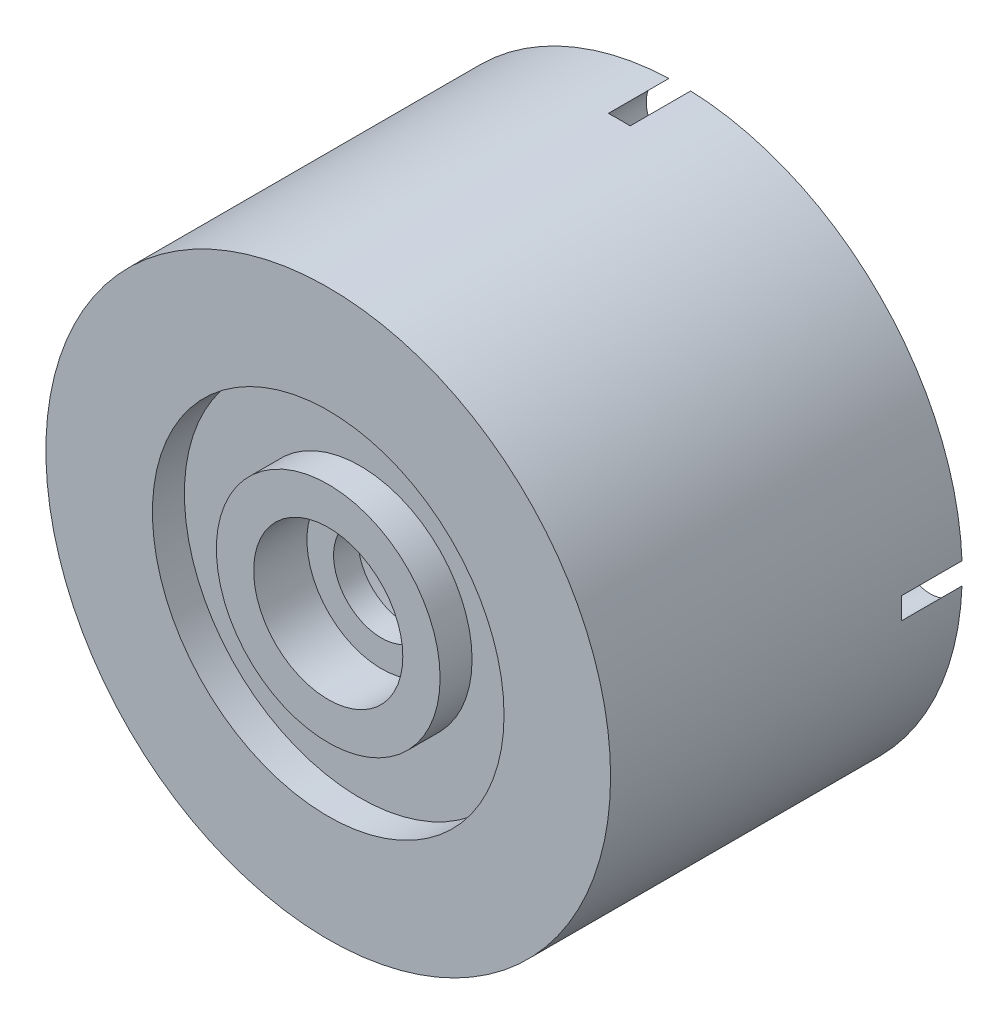
ISO-10303-21;
HEADER;
FILE_DESCRIPTION(('STEP AP214'),'2;1');
FILE_NAME('part.step','',(''),(''),'','','');
FILE_SCHEMA(('AUTOMOTIVE_DESIGN { 1 0 10303 214 1 1 1 1 }'));
ENDSEC;
DATA;
#1=APPLICATION_CONTEXT('core data for automotive mechanical design processes');
#2=APPLICATION_PROTOCOL_DEFINITION('international standard','automotive_design',2000,#1);
#3=PRODUCT_CONTEXT('',#1,'mechanical');
#4=PRODUCT('Part','Part','',(#3));
#5=PRODUCT_RELATED_PRODUCT_CATEGORY('part','',(#4));
#6=PRODUCT_DEFINITION_FORMATION('','',#4);
#7=PRODUCT_DEFINITION_CONTEXT('part definition',#1,'design');
#8=PRODUCT_DEFINITION('design','',#6,#7);
#9=PRODUCT_DEFINITION_SHAPE('','',#8);
#10=(LENGTH_UNIT() NAMED_UNIT(*) SI_UNIT(.MILLI.,.METRE.));
#11=(NAMED_UNIT(*) PLANE_ANGLE_UNIT() SI_UNIT($,.RADIAN.));
#12=(NAMED_UNIT(*) SI_UNIT($,.STERADIAN.) SOLID_ANGLE_UNIT());
#13=UNCERTAINTY_MEASURE_WITH_UNIT(LENGTH_MEASURE(1.E-05),#10,'distance_accuracy_value','');
#14=(GEOMETRIC_REPRESENTATION_CONTEXT(3) GLOBAL_UNCERTAINTY_ASSIGNED_CONTEXT((#13)) GLOBAL_UNIT_ASSIGNED_CONTEXT((#10,
#11,#12)) REPRESENTATION_CONTEXT('',''));
#15=CARTESIAN_POINT('',(0.,0.,0.));
#16=DIRECTION('',(0.,0.,1.));
#17=DIRECTION('',(1.,0.,0.));
#18=AXIS2_PLACEMENT_3D('',#15,#16,#17);
#19=CARTESIAN_POINT('',(0.,0.,-11.01));
#20=DIRECTION('',(0.,0.,-1.));
#21=DIRECTION('',(-1.,0.,0.));
#22=AXIS2_PLACEMENT_3D('',#19,#20,#21);
#23=CYLINDRICAL_SURFACE('',#22,21.5);
#24=CARTESIAN_POINT('',(0.,0.,-11.01));
#25=DIRECTION('',(0.,0.,1.));
#26=DIRECTION('',(1.,0.,0.));
#27=AXIS2_PLACEMENT_3D('',#24,#25,#26);
#28=CIRCLE('',#27,21.5);
#29=CARTESIAN_POINT('',(21.5,0.,-11.01));
#30=VERTEX_POINT('',#29);
#31=EDGE_CURVE('E342',#30,#30,#28,.T.);
#32=ORIENTED_EDGE('',*,*,#31,.T.);
#33=EDGE_LOOP('',(#32));
#34=FACE_BOUND('',#33,.T.);
#35=CARTESIAN_POINT('',(0.,0.,-31.01));
#36=DIRECTION('',(0.,0.,1.));
#37=DIRECTION('',(1.,0.,0.));
#38=AXIS2_PLACEMENT_3D('',#35,#36,#37);
#39=CIRCLE('',#38,21.5);
#40=CARTESIAN_POINT('',(-2.3243448035617,-21.3739893617021,-31.01));
#41=VERTEX_POINT('',#40);
#42=CARTESIAN_POINT('',(2.3243448035617,-21.3739893617021,-31.01));
#43=VERTEX_POINT('',#42);
#44=EDGE_CURVE('E205',#41,#43,#39,.T.);
#45=ORIENTED_EDGE('',*,*,#44,.F.);
#46=DIRECTION('',(0.,0.,-1.));
#47=VECTOR('',#46,1.);
#48=CARTESIAN_POINT('',(-2.3243448035617,-21.3739893617021,-33.86));
#49=LINE('',#48,#47);
#50=CARTESIAN_POINT('',(-2.3243448035617,-21.3739893617021,-36.7));
#51=VERTEX_POINT('',#50);
#52=EDGE_CURVE('E213',#41,#51,#49,.T.);
#53=ORIENTED_EDGE('',*,*,#52,.T.);
#54=CARTESIAN_POINT('',(0.,0.,-36.7));
#55=DIRECTION('',(0.,0.,1.));
#56=DIRECTION('',(1.,0.,0.));
#57=AXIS2_PLACEMENT_3D('',#54,#55,#56);
#58=CIRCLE('',#57,21.5);
#59=CARTESIAN_POINT('',(-13.4875511302153,-16.7432363809936,-36.7));
#60=VERTEX_POINT('',#59);
#61=EDGE_CURVE('E359',#51,#60,#58,.F.);
#62=ORIENTED_EDGE('',*,*,#61,.T.);
#63=DIRECTION('',(0.,0.,-1.));
#64=VECTOR('',#63,1.);
#65=CARTESIAN_POINT('',(-13.4875511302153,-16.7432363809936,-31.2));
#66=LINE('',#65,#64);
#67=CARTESIAN_POINT('',(-13.4875511302153,-16.7432363809936,-25.7));
#68=VERTEX_POINT('',#67);
#69=EDGE_CURVE('E295',#60,#68,#66,.F.);
#70=ORIENTED_EDGE('',*,*,#69,.T.);
#71=CARTESIAN_POINT('',(0.,0.,-25.7));
#72=DIRECTION('',(0.,0.,1.));
#73=DIRECTION('',(1.,0.,0.));
#74=AXIS2_PLACEMENT_3D('',#71,#72,#73);
#75=CIRCLE('',#74,21.5);
#76=CARTESIAN_POINT('',(-16.7432363809936,-13.4875511302153,-25.7));
#77=VERTEX_POINT('',#76);
#78=EDGE_CURVE('E380',#77,#68,#75,.T.);
#79=ORIENTED_EDGE('',*,*,#78,.F.);
#80=DIRECTION('',(0.,0.,-1.));
#81=VECTOR('',#80,1.);
#82=CARTESIAN_POINT('',(-16.7432363809936,-13.4875511302153,-31.2));
#83=LINE('',#82,#81);
#84=CARTESIAN_POINT('',(-16.7432363809936,-13.4875511302153,-36.7));
#85=VERTEX_POINT('',#84);
#86=EDGE_CURVE('E300',#77,#85,#83,.T.);
#87=ORIENTED_EDGE('',*,*,#86,.T.);
#88=CARTESIAN_POINT('',(-21.3739893617021,-2.3243448035617,-36.7));
#89=VERTEX_POINT('',#88);
#90=EDGE_CURVE('E423',#85,#89,#58,.F.);
#91=ORIENTED_EDGE('',*,*,#90,.T.);
#92=DIRECTION('',(0.,0.,-1.));
#93=VECTOR('',#92,1.);
#94=CARTESIAN_POINT('',(-21.3739893617021,-2.3243448035617,-33.86));
#95=LINE('',#94,#93);
#96=CARTESIAN_POINT('',(-21.3739893617021,-2.3243448035617,-31.01));
#97=VERTEX_POINT('',#96);
#98=EDGE_CURVE('E236',#89,#97,#95,.F.);
#99=ORIENTED_EDGE('',*,*,#98,.T.);
#100=CARTESIAN_POINT('',(0.,0.,-31.01));
#101=DIRECTION('',(0.,0.,1.));
#102=DIRECTION('',(1.,0.,0.));
#103=AXIS2_PLACEMENT_3D('',#100,#101,#102);
#104=CIRCLE('',#103,21.5);
#105=CARTESIAN_POINT('',(-21.3739893617021,2.3243448035617,-31.01));
#106=VERTEX_POINT('',#105);
#107=EDGE_CURVE('E239',#106,#97,#104,.T.);
#108=ORIENTED_EDGE('',*,*,#107,.F.);
#109=DIRECTION('',(0.,0.,-1.));
#110=VECTOR('',#109,1.);
#111=CARTESIAN_POINT('',(-21.3739893617021,2.3243448035617,-33.86));
#112=LINE('',#111,#110);
#113=CARTESIAN_POINT('',(-21.3739893617021,2.3243448035617,-36.7));
#114=VERTEX_POINT('',#113);
#115=EDGE_CURVE('E231',#106,#114,#112,.T.);
#116=ORIENTED_EDGE('',*,*,#115,.T.);
#117=CARTESIAN_POINT('',(-16.7432363809936,13.4875511302153,-36.7));
#118=VERTEX_POINT('',#117);
#119=EDGE_CURVE('E424',#114,#118,#58,.F.);
#120=ORIENTED_EDGE('',*,*,#119,.T.);
#121=DIRECTION('',(0.,0.,-1.));
#122=VECTOR('',#121,1.);
#123=CARTESIAN_POINT('',(-16.7432363809936,13.4875511302153,-31.2));
#124=LINE('',#123,#122);
#125=CARTESIAN_POINT('',(-16.7432363809936,13.4875511302153,-25.7));
#126=VERTEX_POINT('',#125);
#127=EDGE_CURVE('E309',#118,#126,#124,.F.);
#128=ORIENTED_EDGE('',*,*,#127,.T.);
#129=CARTESIAN_POINT('',(0.,0.,-25.7));
#130=DIRECTION('',(0.,0.,1.));
#131=DIRECTION('',(1.,0.,0.));
#132=AXIS2_PLACEMENT_3D('',#129,#130,#131);
#133=CIRCLE('',#132,21.5);
#134=CARTESIAN_POINT('',(-13.4875511302153,16.7432363809936,-25.7));
#135=VERTEX_POINT('',#134);
#136=EDGE_CURVE('E375',#135,#126,#133,.T.);
#137=ORIENTED_EDGE('',*,*,#136,.F.);
#138=DIRECTION('',(0.,0.,-1.));
#139=VECTOR('',#138,1.);
#140=CARTESIAN_POINT('',(-13.4875511302153,16.7432363809936,-31.2));
#141=LINE('',#140,#139);
#142=CARTESIAN_POINT('',(-13.4875511302153,16.7432363809936,-36.7));
#143=VERTEX_POINT('',#142);
#144=EDGE_CURVE('E314',#135,#143,#141,.T.);
#145=ORIENTED_EDGE('',*,*,#144,.T.);
#146=CARTESIAN_POINT('',(-2.3243448035617,21.3739893617021,-36.7));
#147=VERTEX_POINT('',#146);
#148=EDGE_CURVE('E360',#143,#147,#58,.F.);
#149=ORIENTED_EDGE('',*,*,#148,.T.);
#150=DIRECTION('',(0.,0.,-1.));
#151=VECTOR('',#150,1.);
#152=CARTESIAN_POINT('',(-2.3243448035617,21.3739893617021,-33.86));
#153=LINE('',#152,#151);
#154=CARTESIAN_POINT('',(-2.3243448035617,21.3739893617021,-31.01));
#155=VERTEX_POINT('',#154);
#156=EDGE_CURVE('E252',#147,#155,#153,.F.);
#157=ORIENTED_EDGE('',*,*,#156,.T.);
#158=CARTESIAN_POINT('',(0.,0.,-31.01));
#159=DIRECTION('',(0.,0.,1.));
#160=DIRECTION('',(1.,0.,0.));
#161=AXIS2_PLACEMENT_3D('',#158,#159,#160);
#162=CIRCLE('',#161,21.5);
#163=CARTESIAN_POINT('',(2.3243448035617,21.3739893617021,-31.01));
#164=VERTEX_POINT('',#163);
#165=EDGE_CURVE('E255',#164,#155,#162,.T.);
#166=ORIENTED_EDGE('',*,*,#165,.F.);
#167=DIRECTION('',(0.,0.,-1.));
#168=VECTOR('',#167,1.);
#169=CARTESIAN_POINT('',(2.3243448035617,21.3739893617021,-33.86));
#170=LINE('',#169,#168);
#171=CARTESIAN_POINT('',(2.3243448035617,21.3739893617021,-36.7));
#172=VERTEX_POINT('',#171);
#173=EDGE_CURVE('E247',#164,#172,#170,.T.);
#174=ORIENTED_EDGE('',*,*,#173,.T.);
#175=CARTESIAN_POINT('',(13.4875511302156,16.7432363809934,-36.7));
#176=VERTEX_POINT('',#175);
#177=EDGE_CURVE('E345',#172,#176,#58,.F.);
#178=ORIENTED_EDGE('',*,*,#177,.T.);
#179=DIRECTION('',(0.,0.,-1.));
#180=VECTOR('',#179,1.);
#181=CARTESIAN_POINT('',(13.4875511302156,16.7432363809934,-31.2));
#182=LINE('',#181,#180);
#183=CARTESIAN_POINT('',(13.4875511302156,16.7432363809934,-25.7));
#184=VERTEX_POINT('',#183);
#185=EDGE_CURVE('E371',#176,#184,#182,.F.);
#186=ORIENTED_EDGE('',*,*,#185,.T.);
#187=CARTESIAN_POINT('',(0.,0.,-25.7));
#188=DIRECTION('',(0.,0.,1.));
#189=DIRECTION('',(1.,0.,0.));
#190=AXIS2_PLACEMENT_3D('',#187,#188,#189);
#191=CIRCLE('',#190,21.5);
#192=CARTESIAN_POINT('',(16.7432363809934,13.4875511302156,-25.7));
#193=VERTEX_POINT('',#192);
#194=EDGE_CURVE('E349',#193,#184,#191,.T.);
#195=ORIENTED_EDGE('',*,*,#194,.F.);
#196=DIRECTION('',(0.,0.,-1.));
#197=VECTOR('',#196,1.);
#198=CARTESIAN_POINT('',(16.7432363809934,13.4875511302156,-31.2));
#199=LINE('',#198,#197);
#200=CARTESIAN_POINT('',(16.7432363809934,13.4875511302156,-36.7));
#201=VERTEX_POINT('',#200);
#202=EDGE_CURVE('E373',#193,#201,#199,.T.);
#203=ORIENTED_EDGE('',*,*,#202,.T.);
#204=CARTESIAN_POINT('',(21.3739893617021,2.3243448035617,-36.7));
#205=VERTEX_POINT('',#204);
#206=EDGE_CURVE('E355',#201,#205,#58,.F.);
#207=ORIENTED_EDGE('',*,*,#206,.T.);
#208=DIRECTION('',(0.,0.,-1.));
#209=VECTOR('',#208,1.);
#210=CARTESIAN_POINT('',(21.3739893617021,2.3243448035617,-33.86));
#211=LINE('',#210,#209);
#212=CARTESIAN_POINT('',(21.3739893617021,2.3243448035617,-31.01));
#213=VERTEX_POINT('',#212);
#214=EDGE_CURVE('E263',#205,#213,#211,.F.);
#215=ORIENTED_EDGE('',*,*,#214,.T.);
#216=CARTESIAN_POINT('',(0.,0.,-31.01));
#217=DIRECTION('',(0.,0.,1.));
#218=DIRECTION('',(1.,0.,0.));
#219=AXIS2_PLACEMENT_3D('',#216,#217,#218);
#220=CIRCLE('',#219,21.5);
#221=CARTESIAN_POINT('',(21.3739893617021,-2.3243448035617,-31.01));
#222=VERTEX_POINT('',#221);
#223=EDGE_CURVE('E272',#222,#213,#220,.T.);
#224=ORIENTED_EDGE('',*,*,#223,.F.);
#225=DIRECTION('',(0.,0.,-1.));
#226=VECTOR('',#225,1.);
#227=CARTESIAN_POINT('',(21.3739893617021,-2.3243448035617,-33.86));
#228=LINE('',#227,#226);
#229=CARTESIAN_POINT('',(21.3739893617021,-2.3243448035617,-36.7));
#230=VERTEX_POINT('',#229);
#231=EDGE_CURVE('E269',#222,#230,#228,.T.);
#232=ORIENTED_EDGE('',*,*,#231,.T.);
#233=CARTESIAN_POINT('',(16.7432363809936,-13.4875511302153,-36.7));
#234=VERTEX_POINT('',#233);
#235=EDGE_CURVE('E358',#230,#234,#58,.F.);
#236=ORIENTED_EDGE('',*,*,#235,.T.);
#237=DIRECTION('',(0.,0.,-1.));
#238=VECTOR('',#237,1.);
#239=CARTESIAN_POINT('',(16.7432363809936,-13.4875511302153,-31.2));
#240=LINE('',#239,#238);
#241=CARTESIAN_POINT('',(16.7432363809936,-13.4875511302153,-25.7));
#242=VERTEX_POINT('',#241);
#243=EDGE_CURVE('E281',#234,#242,#240,.F.);
#244=ORIENTED_EDGE('',*,*,#243,.T.);
#245=CARTESIAN_POINT('',(0.,0.,-25.7));
#246=DIRECTION('',(0.,0.,1.));
#247=DIRECTION('',(1.,0.,0.));
#248=AXIS2_PLACEMENT_3D('',#245,#246,#247);
#249=CIRCLE('',#248,21.5);
#250=CARTESIAN_POINT('',(13.4875511302153,-16.7432363809936,-25.7));
#251=VERTEX_POINT('',#250);
#252=EDGE_CURVE('E385',#251,#242,#249,.T.);
#253=ORIENTED_EDGE('',*,*,#252,.F.);
#254=DIRECTION('',(0.,0.,-1.));
#255=VECTOR('',#254,1.);
#256=CARTESIAN_POINT('',(13.4875511302153,-16.7432363809936,-31.2));
#257=LINE('',#256,#255);
#258=CARTESIAN_POINT('',(13.4875511302153,-16.7432363809936,-36.7));
#259=VERTEX_POINT('',#258);
#260=EDGE_CURVE('E286',#251,#259,#257,.T.);
#261=ORIENTED_EDGE('',*,*,#260,.T.);
#262=CARTESIAN_POINT('',(2.3243448035617,-21.3739893617021,-36.7));
#263=VERTEX_POINT('',#262);
#264=EDGE_CURVE('E221',#259,#263,#58,.F.);
#265=ORIENTED_EDGE('',*,*,#264,.T.);
#266=DIRECTION('',(0.,0.,-1.));
#267=VECTOR('',#266,1.);
#268=CARTESIAN_POINT('',(2.3243448035617,-21.3739893617021,-33.86));
#269=LINE('',#268,#267);
#270=EDGE_CURVE('E56',#263,#43,#269,.F.);
#271=ORIENTED_EDGE('',*,*,#270,.T.);
#272=EDGE_LOOP('',(#45,#53,#62,#70,#79,#87,#91,#99,#108,#116,#120,#128,#137,#145,#149,#157,#166,
#174,#178,#186,#195,#203,#207,#215,#224,#232,#236,#244,#253,#261,#265,#271));
#273=FACE_BOUND('',#272,.T.);
#274=ADVANCED_FACE('F41',(#34,#273),#23,.F.);
#275=CARTESIAN_POINT('',(0.,0.,-3.7));
#276=DIRECTION('',(0.,0.,-1.));
#277=DIRECTION('',(-1.,0.,0.));
#278=AXIS2_PLACEMENT_3D('',#275,#276,#277);
#279=CYLINDRICAL_SURFACE('',#278,26.5);
#280=CARTESIAN_POINT('',(0.,0.,-3.7));
#281=DIRECTION('',(0.,0.,1.));
#282=DIRECTION('',(1.,0.,0.));
#283=AXIS2_PLACEMENT_3D('',#280,#281,#282);
#284=CIRCLE('',#283,26.5);
#285=CARTESIAN_POINT('',(26.5,0.,-3.7));
#286=VERTEX_POINT('',#285);
#287=EDGE_CURVE('E346',#286,#286,#284,.T.);
#288=ORIENTED_EDGE('',*,*,#287,.F.);
#289=EDGE_LOOP('',(#288));
#290=FACE_BOUND('',#289,.T.);
#291=DIRECTION('',(0.,0.,-1.));
#292=VECTOR('',#291,1.);
#293=CARTESIAN_POINT('',(-1.01974541549667,-26.4803723404255,-33.86));
#294=LINE('',#293,#292);
#295=CARTESIAN_POINT('',(-1.01974541549666,-26.4803723404255,-31.01));
#296=VERTEX_POINT('',#295);
#297=CARTESIAN_POINT('',(-1.01974541549667,-26.4803723404255,-36.7));
#298=VERTEX_POINT('',#297);
#299=EDGE_CURVE('E222',#296,#298,#294,.T.);
#300=ORIENTED_EDGE('',*,*,#299,.F.);
#301=CARTESIAN_POINT('',(0.,0.,-31.01));
#302=DIRECTION('',(0.,0.,1.));
#303=DIRECTION('',(1.,0.,0.));
#304=AXIS2_PLACEMENT_3D('',#301,#302,#303);
#305=CIRCLE('',#304,26.5);
#306=CARTESIAN_POINT('',(1.01974541549666,-26.4803723404255,-31.01));
#307=VERTEX_POINT('',#306);
#308=EDGE_CURVE('E11',#296,#307,#305,.T.);
#309=ORIENTED_EDGE('',*,*,#308,.T.);
#310=DIRECTION('',(0.,0.,-1.));
#311=VECTOR('',#310,1.);
#312=CARTESIAN_POINT('',(1.01974541549667,-26.4803723404255,-33.86));
#313=LINE('',#312,#311);
#314=CARTESIAN_POINT('',(1.01974541549667,-26.4803723404255,-36.7));
#315=VERTEX_POINT('',#314);
#316=EDGE_CURVE('E217',#315,#307,#313,.F.);
#317=ORIENTED_EDGE('',*,*,#316,.F.);
#318=CARTESIAN_POINT('',(0.,0.,-36.7));
#319=DIRECTION('',(0.,0.,1.));
#320=DIRECTION('',(1.,0.,0.));
#321=AXIS2_PLACEMENT_3D('',#318,#319,#320);
#322=CIRCLE('',#321,26.5);
#323=CARTESIAN_POINT('',(26.4803723404255,-1.01974541549667,-36.7));
#324=VERTEX_POINT('',#323);
#325=EDGE_CURVE('E354',#315,#324,#322,.T.);
#326=ORIENTED_EDGE('',*,*,#325,.T.);
#327=DIRECTION('',(0.,0.,-1.));
#328=VECTOR('',#327,1.);
#329=CARTESIAN_POINT('',(26.4803723404255,-1.01974541549667,-33.86));
#330=LINE('',#329,#328);
#331=CARTESIAN_POINT('',(26.4803723404255,-1.01974541549665,-31.01));
#332=VERTEX_POINT('',#331);
#333=EDGE_CURVE('E266',#332,#324,#330,.T.);
#334=ORIENTED_EDGE('',*,*,#333,.F.);
#335=CARTESIAN_POINT('',(0.,0.,-31.01));
#336=DIRECTION('',(0.,0.,1.));
#337=DIRECTION('',(1.,0.,0.));
#338=AXIS2_PLACEMENT_3D('',#335,#336,#337);
#339=CIRCLE('',#338,26.5);
#340=CARTESIAN_POINT('',(26.4803723404255,1.01974541549666,-31.01));
#341=VERTEX_POINT('',#340);
#342=EDGE_CURVE('E395',#332,#341,#339,.T.);
#343=ORIENTED_EDGE('',*,*,#342,.T.);
#344=DIRECTION('',(0.,0.,-1.));
#345=VECTOR('',#344,1.);
#346=CARTESIAN_POINT('',(26.4803723404255,1.01974541549667,-33.86));
#347=LINE('',#346,#345);
#348=CARTESIAN_POINT('',(26.4803723404255,1.01974541549667,-36.7));
#349=VERTEX_POINT('',#348);
#350=EDGE_CURVE('E261',#349,#341,#347,.F.);
#351=ORIENTED_EDGE('',*,*,#350,.F.);
#352=CARTESIAN_POINT('',(1.01974541549667,26.4803723404255,-36.7));
#353=VERTEX_POINT('',#352);
#354=EDGE_CURVE('E350',#349,#353,#322,.T.);
#355=ORIENTED_EDGE('',*,*,#354,.T.);
#356=DIRECTION('',(0.,0.,-1.));
#357=VECTOR('',#356,1.);
#358=CARTESIAN_POINT('',(1.01974541549667,26.4803723404255,-33.86));
#359=LINE('',#358,#357);
#360=CARTESIAN_POINT('',(1.01974541549666,26.4803723404255,-31.01));
#361=VERTEX_POINT('',#360);
#362=EDGE_CURVE('E245',#361,#353,#359,.T.);
#363=ORIENTED_EDGE('',*,*,#362,.F.);
#364=CARTESIAN_POINT('',(0.,0.,-31.01));
#365=DIRECTION('',(0.,0.,1.));
#366=DIRECTION('',(1.,0.,0.));
#367=AXIS2_PLACEMENT_3D('',#364,#365,#366);
#368=CIRCLE('',#367,26.5);
#369=CARTESIAN_POINT('',(-1.01974541549666,26.4803723404255,-31.01));
#370=VERTEX_POINT('',#369);
#371=EDGE_CURVE('E401',#361,#370,#368,.T.);
#372=ORIENTED_EDGE('',*,*,#371,.T.);
#373=DIRECTION('',(0.,0.,-1.));
#374=VECTOR('',#373,1.);
#375=CARTESIAN_POINT('',(-1.01974541549667,26.4803723404255,-33.86));
#376=LINE('',#375,#374);
#377=CARTESIAN_POINT('',(-1.01974541549667,26.4803723404255,-36.7));
#378=VERTEX_POINT('',#377);
#379=EDGE_CURVE('E250',#378,#370,#376,.F.);
#380=ORIENTED_EDGE('',*,*,#379,.F.);
#381=CARTESIAN_POINT('',(-26.4803723404255,1.01974541549667,-36.7));
#382=VERTEX_POINT('',#381);
#383=EDGE_CURVE('E353',#378,#382,#322,.T.);
#384=ORIENTED_EDGE('',*,*,#383,.T.);
#385=DIRECTION('',(0.,0.,-1.));
#386=VECTOR('',#385,1.);
#387=CARTESIAN_POINT('',(-26.4803723404255,1.01974541549666,-33.86));
#388=LINE('',#387,#386);
#389=CARTESIAN_POINT('',(-26.4803723404255,1.01974541549665,-31.01));
#390=VERTEX_POINT('',#389);
#391=EDGE_CURVE('E64',#390,#382,#388,.T.);
#392=ORIENTED_EDGE('',*,*,#391,.F.);
#393=CARTESIAN_POINT('',(0.,0.,-31.01));
#394=DIRECTION('',(0.,0.,1.));
#395=DIRECTION('',(1.,0.,0.));
#396=AXIS2_PLACEMENT_3D('',#393,#394,#395);
#397=CIRCLE('',#396,26.5);
#398=CARTESIAN_POINT('',(-26.4803723404255,-1.01974541549666,-31.01));
#399=VERTEX_POINT('',#398);
#400=EDGE_CURVE('E407',#390,#399,#397,.T.);
#401=ORIENTED_EDGE('',*,*,#400,.T.);
#402=DIRECTION('',(0.,0.,-1.));
#403=VECTOR('',#402,1.);
#404=CARTESIAN_POINT('',(-26.4803723404255,-1.01974541549667,-33.86));
#405=LINE('',#404,#403);
#406=CARTESIAN_POINT('',(-26.4803723404255,-1.01974541549668,-36.7));
#407=VERTEX_POINT('',#406);
#408=EDGE_CURVE('E234',#407,#399,#405,.F.);
#409=ORIENTED_EDGE('',*,*,#408,.F.);
#410=EDGE_CURVE('E446',#407,#298,#322,.T.);
#411=ORIENTED_EDGE('',*,*,#410,.T.);
#412=EDGE_LOOP('',(#300,#309,#317,#326,#334,#343,#351,#355,#363,#372,#380,#384,#392,#401,#409,#411));
#413=FACE_BOUND('',#412,.T.);
#414=ADVANCED_FACE('F43',(#290,#413),#279,.T.);
#415=CARTESIAN_POINT('',(0.,0.,-36.7));
#416=DIRECTION('',(0.,0.,1.));
#417=DIRECTION('',(1.,0.,0.));
#418=AXIS2_PLACEMENT_3D('',#415,#416,#417);
#419=PLANE('',#418);
#420=CARTESIAN_POINT('',(0.,-23.5,-36.7));
#421=DIRECTION('',(0.,0.,1.));
#422=DIRECTION('',(1.,0.,0.));
#423=AXIS2_PLACEMENT_3D('',#420,#421,#422);
#424=CIRCLE('',#423,3.15);
#425=EDGE_CURVE('E49',#298,#51,#424,.F.);
#426=ORIENTED_EDGE('',*,*,#425,.F.);
#427=ORIENTED_EDGE('',*,*,#410,.F.);
#428=CARTESIAN_POINT('',(-23.5,0.,-36.7));
#429=DIRECTION('',(0.,0.,1.));
#430=DIRECTION('',(1.,0.,0.));
#431=AXIS2_PLACEMENT_3D('',#428,#429,#430);
#432=CIRCLE('',#431,3.15);
#433=EDGE_CURVE('E406',#89,#407,#432,.F.);
#434=ORIENTED_EDGE('',*,*,#433,.F.);
#435=ORIENTED_EDGE('',*,*,#90,.F.);
#436=CARTESIAN_POINT('',(-16.4755880016466,-16.4755880016466,-36.7));
#437=DIRECTION('',(0.,0.,1.));
#438=DIRECTION('',(1.,0.,0.));
#439=AXIS2_PLACEMENT_3D('',#436,#437,#438);
#440=CIRCLE('',#439,3.);
#441=EDGE_CURVE('E296',#60,#85,#440,.T.);
#442=ORIENTED_EDGE('',*,*,#441,.F.);
#443=ORIENTED_EDGE('',*,*,#61,.F.);
#444=EDGE_LOOP('',(#426,#427,#434,#435,#442,#443));
#445=FACE_BOUND('',#444,.T.);
#446=CARTESIAN_POINT('',(-16.4755880016466,-16.4755880016466,-36.7));
#447=DIRECTION('',(0.,0.,1.));
#448=DIRECTION('',(1.,0.,0.));
#449=AXIS2_PLACEMENT_3D('',#446,#447,#448);
#450=CIRCLE('',#449,1.4);
#451=CARTESIAN_POINT('',(-15.0755880016466,-16.4755880016466,-36.7));
#452=VERTEX_POINT('',#451);
#453=EDGE_CURVE('E291',#452,#452,#450,.F.);
#454=ORIENTED_EDGE('',*,*,#453,.F.);
#455=EDGE_LOOP('',(#454));
#456=FACE_BOUND('',#455,.T.);
#457=ADVANCED_FACE('F420',(#445,#456),#419,.F.);
#458=EDGE_CURVE('E409',#263,#315,#424,.F.);
#459=ORIENTED_EDGE('',*,*,#458,.F.);
#460=ORIENTED_EDGE('',*,*,#264,.F.);
#461=CARTESIAN_POINT('',(16.4755880016466,-16.4755880016466,-36.7));
#462=DIRECTION('',(0.,0.,1.));
#463=DIRECTION('',(1.,0.,0.));
#464=AXIS2_PLACEMENT_3D('',#461,#462,#463);
#465=CIRCLE('',#464,3.);
#466=EDGE_CURVE('E282',#234,#259,#465,.T.);
#467=ORIENTED_EDGE('',*,*,#466,.F.);
#468=ORIENTED_EDGE('',*,*,#235,.F.);
#469=CARTESIAN_POINT('',(23.5,0.,-36.7));
#470=DIRECTION('',(0.,0.,1.));
#471=DIRECTION('',(1.,0.,0.));
#472=AXIS2_PLACEMENT_3D('',#469,#470,#471);
#473=CIRCLE('',#472,3.15);
#474=EDGE_CURVE('E394',#324,#230,#473,.F.);
#475=ORIENTED_EDGE('',*,*,#474,.F.);
#476=ORIENTED_EDGE('',*,*,#325,.F.);
#477=EDGE_LOOP('',(#459,#460,#467,#468,#475,#476));
#478=FACE_BOUND('',#477,.T.);
#479=CARTESIAN_POINT('',(16.4755880016466,-16.4755880016466,-36.7));
#480=DIRECTION('',(0.,0.,1.));
#481=DIRECTION('',(1.,0.,0.));
#482=AXIS2_PLACEMENT_3D('',#479,#480,#481);
#483=CIRCLE('',#482,1.4);
#484=CARTESIAN_POINT('',(17.8755880016466,-16.4755880016466,-36.7));
#485=VERTEX_POINT('',#484);
#486=EDGE_CURVE('E277',#485,#485,#483,.F.);
#487=ORIENTED_EDGE('',*,*,#486,.F.);
#488=EDGE_LOOP('',(#487));
#489=FACE_BOUND('',#488,.T.);
#490=ADVANCED_FACE('F441',(#478,#489),#419,.F.);
#491=EDGE_CURVE('E404',#382,#114,#432,.F.);
#492=ORIENTED_EDGE('',*,*,#491,.F.);
#493=ORIENTED_EDGE('',*,*,#383,.F.);
#494=CARTESIAN_POINT('',(0.,23.5,-36.7));
#495=DIRECTION('',(0.,0.,1.));
#496=DIRECTION('',(1.,0.,0.));
#497=AXIS2_PLACEMENT_3D('',#494,#495,#496);
#498=CIRCLE('',#497,3.15);
#499=EDGE_CURVE('E400',#147,#378,#498,.F.);
#500=ORIENTED_EDGE('',*,*,#499,.F.);
#501=ORIENTED_EDGE('',*,*,#148,.F.);
#502=CARTESIAN_POINT('',(-16.4755880016466,16.4755880016466,-36.7));
#503=DIRECTION('',(0.,0.,1.));
#504=DIRECTION('',(1.,0.,0.));
#505=AXIS2_PLACEMENT_3D('',#502,#503,#504);
#506=CIRCLE('',#505,3.);
#507=EDGE_CURVE('E310',#118,#143,#506,.T.);
#508=ORIENTED_EDGE('',*,*,#507,.F.);
#509=ORIENTED_EDGE('',*,*,#119,.F.);
#510=EDGE_LOOP('',(#492,#493,#500,#501,#508,#509));
#511=FACE_BOUND('',#510,.T.);
#512=CARTESIAN_POINT('',(-16.4755880016466,16.4755880016466,-36.7));
#513=DIRECTION('',(0.,0.,1.));
#514=DIRECTION('',(1.,0.,0.));
#515=AXIS2_PLACEMENT_3D('',#512,#513,#514);
#516=CIRCLE('',#515,1.4);
#517=CARTESIAN_POINT('',(-15.0755880016466,16.4755880016466,-36.7));
#518=VERTEX_POINT('',#517);
#519=EDGE_CURVE('E305',#518,#518,#516,.F.);
#520=ORIENTED_EDGE('',*,*,#519,.F.);
#521=EDGE_LOOP('',(#520));
#522=FACE_BOUND('',#521,.T.);
#523=ADVANCED_FACE('F453',(#511,#522),#419,.F.);
#524=CARTESIAN_POINT('',(0.,0.,-3.7));
#525=DIRECTION('',(0.,0.,1.));
#526=DIRECTION('',(1.,0.,0.));
#527=AXIS2_PLACEMENT_3D('',#524,#525,#526);
#528=PLANE('',#527);
#529=CARTESIAN_POINT('',(0.,0.,-3.7));
#530=DIRECTION('',(0.,0.,1.));
#531=DIRECTION('',(1.,0.,0.));
#532=AXIS2_PLACEMENT_3D('',#529,#530,#531);
#533=CIRCLE('',#532,16.5);
#534=CARTESIAN_POINT('',(16.5,0.,-3.7));
#535=VERTEX_POINT('',#534);
#536=EDGE_CURVE('E341',#535,#535,#533,.F.);
#537=ORIENTED_EDGE('',*,*,#536,.T.);
#538=EDGE_LOOP('',(#537));
#539=FACE_BOUND('',#538,.T.);
#540=ORIENTED_EDGE('',*,*,#287,.T.);
#541=EDGE_LOOP('',(#540));
#542=FACE_BOUND('',#541,.T.);
#543=ADVANCED_FACE('F497',(#539,#542),#528,.T.);
#544=EDGE_CURVE('E398',#353,#172,#498,.F.);
#545=ORIENTED_EDGE('',*,*,#544,.F.);
#546=ORIENTED_EDGE('',*,*,#354,.F.);
#547=EDGE_CURVE('E390',#205,#349,#473,.F.);
#548=ORIENTED_EDGE('',*,*,#547,.F.);
#549=ORIENTED_EDGE('',*,*,#206,.F.);
#550=CARTESIAN_POINT('',(16.4755880016469,16.4755880016469,-36.7));
#551=DIRECTION('',(0.,0.,1.));
#552=DIRECTION('',(1.,0.,0.));
#553=AXIS2_PLACEMENT_3D('',#550,#551,#552);
#554=CIRCLE('',#553,2.99999999999999);
#555=EDGE_CURVE('E324',#176,#201,#554,.T.);
#556=ORIENTED_EDGE('',*,*,#555,.F.);
#557=ORIENTED_EDGE('',*,*,#177,.F.);
#558=EDGE_LOOP('',(#545,#546,#548,#549,#556,#557));
#559=FACE_BOUND('',#558,.T.);
#560=CARTESIAN_POINT('',(16.4755880016469,16.4755880016469,-36.7));
#561=DIRECTION('',(0.,0.,1.));
#562=DIRECTION('',(1.,0.,0.));
#563=AXIS2_PLACEMENT_3D('',#560,#561,#562);
#564=CIRCLE('',#563,1.4);
#565=CARTESIAN_POINT('',(17.8755880016469,16.4755880016469,-36.7));
#566=VERTEX_POINT('',#565);
#567=EDGE_CURVE('E319',#566,#566,#564,.F.);
#568=ORIENTED_EDGE('',*,*,#567,.F.);
#569=EDGE_LOOP('',(#568));
#570=FACE_BOUND('',#569,.T.);
#571=ADVANCED_FACE('F499',(#559,#570),#419,.F.);
#572=CARTESIAN_POINT('',(0.,0.,-11.01));
#573=DIRECTION('',(0.,0.,1.));
#574=DIRECTION('',(1.,0.,0.));
#575=AXIS2_PLACEMENT_3D('',#572,#573,#574);
#576=PLANE('',#575);
#577=CARTESIAN_POINT('',(0.,0.,-11.01));
#578=DIRECTION('',(0.,0.,1.));
#579=DIRECTION('',(1.,0.,0.));
#580=AXIS2_PLACEMENT_3D('',#577,#578,#579);
#581=CIRCLE('',#580,4.5);
#582=CARTESIAN_POINT('',(4.5,0.,-11.01));
#583=VERTEX_POINT('',#582);
#584=EDGE_CURVE('E327',#583,#583,#581,.F.);
#585=ORIENTED_EDGE('',*,*,#584,.F.);
#586=EDGE_LOOP('',(#585));
#587=FACE_BOUND('',#586,.T.);
#588=ORIENTED_EDGE('',*,*,#31,.F.);
#589=EDGE_LOOP('',(#588));
#590=FACE_BOUND('',#589,.T.);
#591=ADVANCED_FACE('F495',(#587,#590),#576,.F.);
#592=CARTESIAN_POINT('',(0.,0.,-3.6));
#593=DIRECTION('',(0.,0.,-1.));
#594=DIRECTION('',(-1.,0.,0.));
#595=AXIS2_PLACEMENT_3D('',#592,#593,#594);
#596=CYLINDRICAL_SURFACE('',#595,16.5);
#597=ORIENTED_EDGE('',*,*,#536,.F.);
#598=EDGE_LOOP('',(#597));
#599=FACE_BOUND('',#598,.T.);
#600=CARTESIAN_POINT('',(0.,0.,-6.7));
#601=DIRECTION('',(0.,0.,1.));
#602=DIRECTION('',(1.,0.,0.));
#603=AXIS2_PLACEMENT_3D('',#600,#601,#602);
#604=CIRCLE('',#603,16.5);
#605=CARTESIAN_POINT('',(16.5,0.,-6.7));
#606=VERTEX_POINT('',#605);
#607=EDGE_CURVE('E331',#606,#606,#604,.T.);
#608=ORIENTED_EDGE('',*,*,#607,.F.);
#609=EDGE_LOOP('',(#608));
#610=FACE_BOUND('',#609,.T.);
#611=ADVANCED_FACE('F507',(#599,#610),#596,.F.);
#612=CARTESIAN_POINT('',(0.,0.,-6.7));
#613=DIRECTION('',(0.,0.,1.));
#614=DIRECTION('',(1.,0.,0.));
#615=AXIS2_PLACEMENT_3D('',#612,#613,#614);
#616=PLANE('',#615);
#617=CARTESIAN_POINT('',(0.,0.,-6.7));
#618=DIRECTION('',(0.,0.,1.));
#619=DIRECTION('',(1.,0.,0.));
#620=AXIS2_PLACEMENT_3D('',#617,#618,#619);
#621=CIRCLE('',#620,10.5);
#622=CARTESIAN_POINT('',(10.5,0.,-6.7));
#623=VERTEX_POINT('',#622);
#624=EDGE_CURVE('E330',#623,#623,#621,.F.);
#625=ORIENTED_EDGE('',*,*,#624,.T.);
#626=EDGE_LOOP('',(#625));
#627=FACE_BOUND('',#626,.T.);
#628=ORIENTED_EDGE('',*,*,#607,.T.);
#629=EDGE_LOOP('',(#628));
#630=FACE_BOUND('',#629,.T.);
#631=ADVANCED_FACE('F856',(#627,#630),#616,.T.);
#632=CARTESIAN_POINT('',(0.,0.,-3.5));
#633=DIRECTION('',(0.,0.,-1.));
#634=DIRECTION('',(-1.,0.,0.));
#635=AXIS2_PLACEMENT_3D('',#632,#633,#634);
#636=CYLINDRICAL_SURFACE('',#635,10.5);
#637=CARTESIAN_POINT('',(0.,0.,-3.7));
#638=DIRECTION('',(0.,0.,1.));
#639=DIRECTION('',(1.,0.,0.));
#640=AXIS2_PLACEMENT_3D('',#637,#638,#639);
#641=CIRCLE('',#640,10.5);
#642=CARTESIAN_POINT('',(10.5,0.,-3.7));
#643=VERTEX_POINT('',#642);
#644=EDGE_CURVE('E334',#643,#643,#641,.F.);
#645=ORIENTED_EDGE('',*,*,#644,.T.);
#646=EDGE_LOOP('',(#645));
#647=FACE_BOUND('',#646,.T.);
#648=ORIENTED_EDGE('',*,*,#624,.F.);
#649=EDGE_LOOP('',(#648));
#650=FACE_BOUND('',#649,.T.);
#651=ADVANCED_FACE('F850',(#647,#650),#636,.T.);
#652=CARTESIAN_POINT('',(0.,0.,-8.7));
#653=DIRECTION('',(0.,0.,1.));
#654=DIRECTION('',(1.,0.,0.));
#655=AXIS2_PLACEMENT_3D('',#652,#653,#654);
#656=PLANE('',#655);
#657=CARTESIAN_POINT('',(0.,0.,-8.7));
#658=DIRECTION('',(0.,0.,1.));
#659=DIRECTION('',(1.,0.,0.));
#660=AXIS2_PLACEMENT_3D('',#657,#658,#659);
#661=CIRCLE('',#660,4.5);
#662=CARTESIAN_POINT('',(4.5,0.,-8.7));
#663=VERTEX_POINT('',#662);
#664=EDGE_CURVE('E323',#663,#663,#661,.F.);
#665=ORIENTED_EDGE('',*,*,#664,.T.);
#666=EDGE_LOOP('',(#665));
#667=FACE_BOUND('',#666,.T.);
#668=CARTESIAN_POINT('',(0.,0.,-8.7));
#669=DIRECTION('',(0.,0.,1.));
#670=DIRECTION('',(1.,0.,0.));
#671=AXIS2_PLACEMENT_3D('',#668,#669,#670);
#672=CIRCLE('',#671,7.);
#673=CARTESIAN_POINT('',(7.,0.,-8.7));
#674=VERTEX_POINT('',#673);
#675=EDGE_CURVE('E337',#674,#674,#672,.T.);
#676=ORIENTED_EDGE('',*,*,#675,.T.);
#677=EDGE_LOOP('',(#676));
#678=FACE_BOUND('',#677,.T.);
#679=ADVANCED_FACE('F855',(#667,#678),#656,.T.);
#680=CARTESIAN_POINT('',(0.,0.,-3.69));
#681=DIRECTION('',(0.,0.,-1.));
#682=DIRECTION('',(-1.,0.,0.));
#683=AXIS2_PLACEMENT_3D('',#680,#681,#682);
#684=CYLINDRICAL_SURFACE('',#683,7.);
#685=CARTESIAN_POINT('',(0.,0.,-3.7));
#686=DIRECTION('',(0.,0.,1.));
#687=DIRECTION('',(1.,0.,0.));
#688=AXIS2_PLACEMENT_3D('',#685,#686,#687);
#689=CIRCLE('',#688,7.);
#690=CARTESIAN_POINT('',(7.,0.,-3.7));
#691=VERTEX_POINT('',#690);
#692=EDGE_CURVE('E340',#691,#691,#689,.F.);
#693=ORIENTED_EDGE('',*,*,#692,.F.);
#694=EDGE_LOOP('',(#693));
#695=FACE_BOUND('',#694,.T.);
#696=ORIENTED_EDGE('',*,*,#675,.F.);
#697=EDGE_LOOP('',(#696));
#698=FACE_BOUND('',#697,.T.);
#699=ADVANCED_FACE('F869',(#695,#698),#684,.F.);
#700=ORIENTED_EDGE('',*,*,#692,.T.);
#701=EDGE_LOOP('',(#700));
#702=FACE_BOUND('',#701,.T.);
#703=ORIENTED_EDGE('',*,*,#644,.F.);
#704=EDGE_LOOP('',(#703));
#705=FACE_BOUND('',#704,.T.);
#706=ADVANCED_FACE('F501',(#702,#705),#528,.T.);
#707=CARTESIAN_POINT('',(0.,0.,-3.));
#708=DIRECTION('',(0.,0.,-1.));
#709=DIRECTION('',(-1.,0.,0.));
#710=AXIS2_PLACEMENT_3D('',#707,#708,#709);
#711=CYLINDRICAL_SURFACE('',#710,4.5);
#712=ORIENTED_EDGE('',*,*,#664,.F.);
#713=EDGE_LOOP('',(#712));
#714=FACE_BOUND('',#713,.T.);
#715=ORIENTED_EDGE('',*,*,#584,.T.);
#716=EDGE_LOOP('',(#715));
#717=FACE_BOUND('',#716,.T.);
#718=ADVANCED_FACE('F868',(#714,#717),#711,.F.);
#719=CARTESIAN_POINT('',(16.4755880016469,16.4755880016469,-25.7));
#720=DIRECTION('',(0.,0.,1.));
#721=DIRECTION('',(1.,0.,0.));
#722=AXIS2_PLACEMENT_3D('',#719,#720,#721);
#723=PLANE('',#722);
#724=CARTESIAN_POINT('',(16.4755880016469,16.4755880016469,-25.7));
#725=DIRECTION('',(0.,0.,1.));
#726=DIRECTION('',(1.,0.,0.));
#727=AXIS2_PLACEMENT_3D('',#724,#725,#726);
#728=CIRCLE('',#727,2.99999999999999);
#729=EDGE_CURVE('E320',#184,#193,#728,.T.);
#730=ORIENTED_EDGE('',*,*,#729,.T.);
#731=ORIENTED_EDGE('',*,*,#194,.T.);
#732=EDGE_LOOP('',(#730,#731));
#733=FACE_BOUND('',#732,.T.);
#734=ADVANCED_FACE('F921',(#733),#723,.T.);
#735=CARTESIAN_POINT('',(16.4755880016469,16.4755880016469,-25.7));
#736=DIRECTION('',(0.,0.,-1.));
#737=DIRECTION('',(-1.,0.,0.));
#738=AXIS2_PLACEMENT_3D('',#735,#736,#737);
#739=CYLINDRICAL_SURFACE('',#738,2.99999999999999);
#740=ORIENTED_EDGE('',*,*,#202,.F.);
#741=ORIENTED_EDGE('',*,*,#729,.F.);
#742=ORIENTED_EDGE('',*,*,#185,.F.);
#743=ORIENTED_EDGE('',*,*,#555,.T.);
#744=EDGE_LOOP('',(#740,#741,#742,#743));
#745=FACE_BOUND('',#744,.T.);
#746=ADVANCED_FACE('F842',(#745),#739,.T.);
#747=CARTESIAN_POINT('',(16.4755880016469,16.4755880016469,-27.71));
#748=DIRECTION('',(0.,0.,-1.));
#749=DIRECTION('',(-1.,0.,0.));
#750=AXIS2_PLACEMENT_3D('',#747,#748,#749);
#751=CYLINDRICAL_SURFACE('',#750,1.4);
#752=CARTESIAN_POINT('',(16.4755880016469,16.4755880016469,-27.71));
#753=DIRECTION('',(0.,0.,1.));
#754=DIRECTION('',(1.,0.,0.));
#755=AXIS2_PLACEMENT_3D('',#752,#753,#754);
#756=CIRCLE('',#755,1.4);
#757=CARTESIAN_POINT('',(17.8755880016469,16.4755880016469,-27.71));
#758=VERTEX_POINT('',#757);
#759=EDGE_CURVE('E316',#758,#758,#756,.T.);
#760=ORIENTED_EDGE('',*,*,#759,.T.);
#761=EDGE_LOOP('',(#760));
#762=FACE_BOUND('',#761,.T.);
#763=ORIENTED_EDGE('',*,*,#567,.T.);
#764=EDGE_LOOP('',(#763));
#765=FACE_BOUND('',#764,.T.);
#766=ADVANCED_FACE('F836',(#762,#765),#751,.F.);
#767=CARTESIAN_POINT('',(16.4755880016469,16.4755880016469,-27.71));
#768=DIRECTION('',(0.,0.,1.));
#769=DIRECTION('',(1.,0.,0.));
#770=AXIS2_PLACEMENT_3D('',#767,#768,#769);
#771=PLANE('',#770);
#772=ORIENTED_EDGE('',*,*,#759,.F.);
#773=EDGE_LOOP('',(#772));
#774=FACE_BOUND('',#773,.T.);
#775=ADVANCED_FACE('F841',(#774),#771,.F.);
#776=CARTESIAN_POINT('',(-16.4755880016466,16.4755880016466,-25.7));
#777=DIRECTION('',(0.,0.,1.));
#778=DIRECTION('',(1.,0.,0.));
#779=AXIS2_PLACEMENT_3D('',#776,#777,#778);
#780=PLANE('',#779);
#781=CARTESIAN_POINT('',(-16.4755880016466,16.4755880016466,-25.7));
#782=DIRECTION('',(0.,0.,1.));
#783=DIRECTION('',(1.,0.,0.));
#784=AXIS2_PLACEMENT_3D('',#781,#782,#783);
#785=CIRCLE('',#784,3.);
#786=EDGE_CURVE('E306',#126,#135,#785,.T.);
#787=ORIENTED_EDGE('',*,*,#786,.T.);
#788=ORIENTED_EDGE('',*,*,#136,.T.);
#789=EDGE_LOOP('',(#787,#788));
#790=FACE_BOUND('',#789,.T.);
#791=ADVANCED_FACE('F954',(#790),#780,.T.);
#792=CARTESIAN_POINT('',(-16.4755880016466,16.4755880016466,-25.7));
#793=DIRECTION('',(0.,0.,-1.));
#794=DIRECTION('',(-1.,0.,0.));
#795=AXIS2_PLACEMENT_3D('',#792,#793,#794);
#796=CYLINDRICAL_SURFACE('',#795,3.);
#797=ORIENTED_EDGE('',*,*,#144,.F.);
#798=ORIENTED_EDGE('',*,*,#786,.F.);
#799=ORIENTED_EDGE('',*,*,#127,.F.);
#800=ORIENTED_EDGE('',*,*,#507,.T.);
#801=EDGE_LOOP('',(#797,#798,#799,#800));
#802=FACE_BOUND('',#801,.T.);
#803=ADVANCED_FACE('F829',(#802),#796,.T.);
#804=CARTESIAN_POINT('',(-16.4755880016466,16.4755880016466,-27.71));
#805=DIRECTION('',(0.,0.,-1.));
#806=DIRECTION('',(-1.,0.,0.));
#807=AXIS2_PLACEMENT_3D('',#804,#805,#806);
#808=CYLINDRICAL_SURFACE('',#807,1.4);
#809=CARTESIAN_POINT('',(-16.4755880016466,16.4755880016466,-27.71));
#810=DIRECTION('',(0.,0.,1.));
#811=DIRECTION('',(1.,0.,0.));
#812=AXIS2_PLACEMENT_3D('',#809,#810,#811);
#813=CIRCLE('',#812,1.4);
#814=CARTESIAN_POINT('',(-15.0755880016466,16.4755880016466,-27.71));
#815=VERTEX_POINT('',#814);
#816=EDGE_CURVE('E302',#815,#815,#813,.T.);
#817=ORIENTED_EDGE('',*,*,#816,.T.);
#818=EDGE_LOOP('',(#817));
#819=FACE_BOUND('',#818,.T.);
#820=ORIENTED_EDGE('',*,*,#519,.T.);
#821=EDGE_LOOP('',(#820));
#822=FACE_BOUND('',#821,.T.);
#823=ADVANCED_FACE('F482',(#819,#822),#808,.F.);
#824=CARTESIAN_POINT('',(-16.4755880016466,16.4755880016466,-27.71));
#825=DIRECTION('',(0.,0.,1.));
#826=DIRECTION('',(1.,0.,0.));
#827=AXIS2_PLACEMENT_3D('',#824,#825,#826);
#828=PLANE('',#827);
#829=ORIENTED_EDGE('',*,*,#816,.F.);
#830=EDGE_LOOP('',(#829));
#831=FACE_BOUND('',#830,.T.);
#832=ADVANCED_FACE('F474',(#831),#828,.F.);
#833=CARTESIAN_POINT('',(-16.4755880016466,-16.4755880016466,-25.7));
#834=DIRECTION('',(0.,0.,1.));
#835=DIRECTION('',(1.,0.,0.));
#836=AXIS2_PLACEMENT_3D('',#833,#834,#835);
#837=PLANE('',#836);
#838=CARTESIAN_POINT('',(-16.4755880016466,-16.4755880016466,-25.7));
#839=DIRECTION('',(0.,0.,1.));
#840=DIRECTION('',(1.,0.,0.));
#841=AXIS2_PLACEMENT_3D('',#838,#839,#840);
#842=CIRCLE('',#841,3.);
#843=EDGE_CURVE('E292',#68,#77,#842,.T.);
#844=ORIENTED_EDGE('',*,*,#843,.T.);
#845=ORIENTED_EDGE('',*,*,#78,.T.);
#846=EDGE_LOOP('',(#844,#845));
#847=FACE_BOUND('',#846,.T.);
#848=ADVANCED_FACE('F472',(#847),#837,.T.);
#849=CARTESIAN_POINT('',(-16.4755880016466,-16.4755880016466,-25.7));
#850=DIRECTION('',(0.,0.,-1.));
#851=DIRECTION('',(-1.,0.,0.));
#852=AXIS2_PLACEMENT_3D('',#849,#850,#851);
#853=CYLINDRICAL_SURFACE('',#852,3.);
#854=ORIENTED_EDGE('',*,*,#86,.F.);
#855=ORIENTED_EDGE('',*,*,#843,.F.);
#856=ORIENTED_EDGE('',*,*,#69,.F.);
#857=ORIENTED_EDGE('',*,*,#441,.T.);
#858=EDGE_LOOP('',(#854,#855,#856,#857));
#859=FACE_BOUND('',#858,.T.);
#860=ADVANCED_FACE('F470',(#859),#853,.T.);
#861=CARTESIAN_POINT('',(-16.4755880016466,-16.4755880016466,-27.71));
#862=DIRECTION('',(0.,0.,-1.));
#863=DIRECTION('',(-1.,0.,0.));
#864=AXIS2_PLACEMENT_3D('',#861,#862,#863);
#865=CYLINDRICAL_SURFACE('',#864,1.4);
#866=CARTESIAN_POINT('',(-16.4755880016466,-16.4755880016466,-27.71));
#867=DIRECTION('',(0.,0.,1.));
#868=DIRECTION('',(1.,0.,0.));
#869=AXIS2_PLACEMENT_3D('',#866,#867,#868);
#870=CIRCLE('',#869,1.4);
#871=CARTESIAN_POINT('',(-15.0755880016466,-16.4755880016466,-27.71));
#872=VERTEX_POINT('',#871);
#873=EDGE_CURVE('E288',#872,#872,#870,.T.);
#874=ORIENTED_EDGE('',*,*,#873,.T.);
#875=EDGE_LOOP('',(#874));
#876=FACE_BOUND('',#875,.T.);
#877=ORIENTED_EDGE('',*,*,#453,.T.);
#878=EDGE_LOOP('',(#877));
#879=FACE_BOUND('',#878,.T.);
#880=ADVANCED_FACE('F480',(#876,#879),#865,.F.);
#881=CARTESIAN_POINT('',(-16.4755880016466,-16.4755880016466,-27.71));
#882=DIRECTION('',(0.,0.,1.));
#883=DIRECTION('',(1.,0.,0.));
#884=AXIS2_PLACEMENT_3D('',#881,#882,#883);
#885=PLANE('',#884);
#886=ORIENTED_EDGE('',*,*,#873,.F.);
#887=EDGE_LOOP('',(#886));
#888=FACE_BOUND('',#887,.T.);
#889=ADVANCED_FACE('F685',(#888),#885,.F.);
#890=CARTESIAN_POINT('',(16.4755880016466,-16.4755880016466,-25.7));
#891=DIRECTION('',(0.,0.,1.));
#892=DIRECTION('',(1.,0.,0.));
#893=AXIS2_PLACEMENT_3D('',#890,#891,#892);
#894=PLANE('',#893);
#895=CARTESIAN_POINT('',(16.4755880016466,-16.4755880016466,-25.7));
#896=DIRECTION('',(0.,0.,1.));
#897=DIRECTION('',(1.,0.,0.));
#898=AXIS2_PLACEMENT_3D('',#895,#896,#897);
#899=CIRCLE('',#898,3.);
#900=EDGE_CURVE('E278',#242,#251,#899,.T.);
#901=ORIENTED_EDGE('',*,*,#900,.T.);
#902=ORIENTED_EDGE('',*,*,#252,.T.);
#903=EDGE_LOOP('',(#901,#902));
#904=FACE_BOUND('',#903,.T.);
#905=ADVANCED_FACE('F676',(#904),#894,.T.);
#906=CARTESIAN_POINT('',(16.4755880016466,-16.4755880016466,-25.7));
#907=DIRECTION('',(0.,0.,-1.));
#908=DIRECTION('',(-1.,0.,0.));
#909=AXIS2_PLACEMENT_3D('',#906,#907,#908);
#910=CYLINDRICAL_SURFACE('',#909,3.);
#911=ORIENTED_EDGE('',*,*,#260,.F.);
#912=ORIENTED_EDGE('',*,*,#900,.F.);
#913=ORIENTED_EDGE('',*,*,#243,.F.);
#914=ORIENTED_EDGE('',*,*,#466,.T.);
#915=EDGE_LOOP('',(#911,#912,#913,#914));
#916=FACE_BOUND('',#915,.T.);
#917=ADVANCED_FACE('F440',(#916),#910,.T.);
#918=CARTESIAN_POINT('',(16.4755880016466,-16.4755880016466,-27.71));
#919=DIRECTION('',(0.,0.,-1.));
#920=DIRECTION('',(-1.,0.,0.));
#921=AXIS2_PLACEMENT_3D('',#918,#919,#920);
#922=CYLINDRICAL_SURFACE('',#921,1.4);
#923=CARTESIAN_POINT('',(16.4755880016466,-16.4755880016466,-27.71));
#924=DIRECTION('',(0.,0.,1.));
#925=DIRECTION('',(1.,0.,0.));
#926=AXIS2_PLACEMENT_3D('',#923,#924,#925);
#927=CIRCLE('',#926,1.4);
#928=CARTESIAN_POINT('',(17.8755880016466,-16.4755880016466,-27.71));
#929=VERTEX_POINT('',#928);
#930=EDGE_CURVE('E274',#929,#929,#927,.T.);
#931=ORIENTED_EDGE('',*,*,#930,.T.);
#932=EDGE_LOOP('',(#931));
#933=FACE_BOUND('',#932,.T.);
#934=ORIENTED_EDGE('',*,*,#486,.T.);
#935=EDGE_LOOP('',(#934));
#936=FACE_BOUND('',#935,.T.);
#937=ADVANCED_FACE('F659',(#933,#936),#922,.F.);
#938=CARTESIAN_POINT('',(16.4755880016466,-16.4755880016466,-27.71));
#939=DIRECTION('',(0.,0.,1.));
#940=DIRECTION('',(1.,0.,0.));
#941=AXIS2_PLACEMENT_3D('',#938,#939,#940);
#942=PLANE('',#941);
#943=ORIENTED_EDGE('',*,*,#930,.F.);
#944=EDGE_LOOP('',(#943));
#945=FACE_BOUND('',#944,.T.);
#946=ADVANCED_FACE('F650',(#945),#942,.F.);
#947=CARTESIAN_POINT('',(23.5,0.,-31.01));
#948=DIRECTION('',(0.,0.,1.));
#949=DIRECTION('',(1.,0.,0.));
#950=AXIS2_PLACEMENT_3D('',#947,#948,#949);
#951=PLANE('',#950);
#952=ORIENTED_EDGE('',*,*,#223,.T.);
#953=CARTESIAN_POINT('',(23.5,0.,-31.01));
#954=DIRECTION('',(0.,0.,1.));
#955=DIRECTION('',(1.,0.,0.));
#956=AXIS2_PLACEMENT_3D('',#953,#954,#955);
#957=CIRCLE('',#956,3.15);
#958=EDGE_CURVE('E258',#341,#213,#957,.T.);
#959=ORIENTED_EDGE('',*,*,#958,.F.);
#960=ORIENTED_EDGE('',*,*,#342,.F.);
#961=EDGE_CURVE('E257',#222,#332,#957,.T.);
#962=ORIENTED_EDGE('',*,*,#961,.F.);
#963=EDGE_LOOP('',(#952,#959,#960,#962));
#964=FACE_BOUND('',#963,.T.);
#965=ADVANCED_FACE('F643',(#964),#951,.F.);
#966=CARTESIAN_POINT('',(23.5,0.,-31.01));
#967=DIRECTION('',(0.,0.,-1.));
#968=DIRECTION('',(-1.,0.,0.));
#969=AXIS2_PLACEMENT_3D('',#966,#967,#968);
#970=CYLINDRICAL_SURFACE('',#969,3.15);
#971=ORIENTED_EDGE('',*,*,#961,.T.);
#972=ORIENTED_EDGE('',*,*,#333,.T.);
#973=ORIENTED_EDGE('',*,*,#474,.T.);
#974=ORIENTED_EDGE('',*,*,#231,.F.);
#975=EDGE_LOOP('',(#971,#972,#973,#974));
#976=FACE_BOUND('',#975,.T.);
#977=ADVANCED_FACE('F634',(#976),#970,.F.);
#978=ORIENTED_EDGE('',*,*,#547,.T.);
#979=ORIENTED_EDGE('',*,*,#350,.T.);
#980=ORIENTED_EDGE('',*,*,#958,.T.);
#981=ORIENTED_EDGE('',*,*,#214,.F.);
#982=EDGE_LOOP('',(#978,#979,#980,#981));
#983=FACE_BOUND('',#982,.T.);
#984=ADVANCED_FACE('F625',(#983),#970,.F.);
#985=CARTESIAN_POINT('',(0.,23.5,-31.01));
#986=DIRECTION('',(0.,0.,1.));
#987=DIRECTION('',(1.,0.,0.));
#988=AXIS2_PLACEMENT_3D('',#985,#986,#987);
#989=PLANE('',#988);
#990=ORIENTED_EDGE('',*,*,#165,.T.);
#991=CARTESIAN_POINT('',(0.,23.5,-31.01));
#992=DIRECTION('',(0.,0.,1.));
#993=DIRECTION('',(1.,0.,0.));
#994=AXIS2_PLACEMENT_3D('',#991,#992,#993);
#995=CIRCLE('',#994,3.15);
#996=EDGE_CURVE('E244',#370,#155,#995,.T.);
#997=ORIENTED_EDGE('',*,*,#996,.F.);
#998=ORIENTED_EDGE('',*,*,#371,.F.);
#999=EDGE_CURVE('E241',#164,#361,#995,.T.);
#1000=ORIENTED_EDGE('',*,*,#999,.F.);
#1001=EDGE_LOOP('',(#990,#997,#998,#1000));
#1002=FACE_BOUND('',#1001,.T.);
#1003=ADVANCED_FACE('F618',(#1002),#989,.F.);
#1004=CARTESIAN_POINT('',(0.,23.5,-31.01));
#1005=DIRECTION('',(0.,0.,-1.));
#1006=DIRECTION('',(-1.,0.,0.));
#1007=AXIS2_PLACEMENT_3D('',#1004,#1005,#1006);
#1008=CYLINDRICAL_SURFACE('',#1007,3.15);
#1009=ORIENTED_EDGE('',*,*,#499,.T.);
#1010=ORIENTED_EDGE('',*,*,#379,.T.);
#1011=ORIENTED_EDGE('',*,*,#996,.T.);
#1012=ORIENTED_EDGE('',*,*,#156,.F.);
#1013=EDGE_LOOP('',(#1009,#1010,#1011,#1012));
#1014=FACE_BOUND('',#1013,.T.);
#1015=ADVANCED_FACE('F609',(#1014),#1008,.F.);
#1016=ORIENTED_EDGE('',*,*,#999,.T.);
#1017=ORIENTED_EDGE('',*,*,#362,.T.);
#1018=ORIENTED_EDGE('',*,*,#544,.T.);
#1019=ORIENTED_EDGE('',*,*,#173,.F.);
#1020=EDGE_LOOP('',(#1016,#1017,#1018,#1019));
#1021=FACE_BOUND('',#1020,.T.);
#1022=ADVANCED_FACE('F602',(#1021),#1008,.F.);
#1023=CARTESIAN_POINT('',(-23.5,0.,-31.01));
#1024=DIRECTION('',(0.,0.,1.));
#1025=DIRECTION('',(1.,0.,0.));
#1026=AXIS2_PLACEMENT_3D('',#1023,#1024,#1025);
#1027=PLANE('',#1026);
#1028=ORIENTED_EDGE('',*,*,#107,.T.);
#1029=CARTESIAN_POINT('',(-23.5,0.,-31.01));
#1030=DIRECTION('',(0.,0.,1.));
#1031=DIRECTION('',(1.,0.,0.));
#1032=AXIS2_PLACEMENT_3D('',#1029,#1030,#1031);
#1033=CIRCLE('',#1032,3.15);
#1034=EDGE_CURVE('E212',#399,#97,#1033,.T.);
#1035=ORIENTED_EDGE('',*,*,#1034,.F.);
#1036=ORIENTED_EDGE('',*,*,#400,.F.);
#1037=EDGE_CURVE('E228',#106,#390,#1033,.T.);
#1038=ORIENTED_EDGE('',*,*,#1037,.F.);
#1039=EDGE_LOOP('',(#1028,#1035,#1036,#1038));
#1040=FACE_BOUND('',#1039,.T.);
#1041=ADVANCED_FACE('F463',(#1040),#1027,.F.);
#1042=CARTESIAN_POINT('',(-23.5,0.,-31.01));
#1043=DIRECTION('',(0.,0.,-1.));
#1044=DIRECTION('',(-1.,0.,0.));
#1045=AXIS2_PLACEMENT_3D('',#1042,#1043,#1044);
#1046=CYLINDRICAL_SURFACE('',#1045,3.15);
#1047=ORIENTED_EDGE('',*,*,#433,.T.);
#1048=ORIENTED_EDGE('',*,*,#408,.T.);
#1049=ORIENTED_EDGE('',*,*,#1034,.T.);
#1050=ORIENTED_EDGE('',*,*,#98,.F.);
#1051=EDGE_LOOP('',(#1047,#1048,#1049,#1050));
#1052=FACE_BOUND('',#1051,.T.);
#1053=ADVANCED_FACE('F465',(#1052),#1046,.F.);
#1054=ORIENTED_EDGE('',*,*,#1037,.T.);
#1055=ORIENTED_EDGE('',*,*,#391,.T.);
#1056=ORIENTED_EDGE('',*,*,#491,.T.);
#1057=ORIENTED_EDGE('',*,*,#115,.F.);
#1058=EDGE_LOOP('',(#1054,#1055,#1056,#1057));
#1059=FACE_BOUND('',#1058,.T.);
#1060=ADVANCED_FACE('F457',(#1059),#1046,.F.);
#1061=CARTESIAN_POINT('',(0.,-23.5,-31.01));
#1062=DIRECTION('',(0.,0.,1.));
#1063=DIRECTION('',(1.,0.,0.));
#1064=AXIS2_PLACEMENT_3D('',#1061,#1062,#1063);
#1065=PLANE('',#1064);
#1066=ORIENTED_EDGE('',*,*,#44,.T.);
#1067=CARTESIAN_POINT('',(0.,-23.5,-31.01));
#1068=DIRECTION('',(0.,0.,1.));
#1069=DIRECTION('',(1.,0.,0.));
#1070=AXIS2_PLACEMENT_3D('',#1067,#1068,#1069);
#1071=CIRCLE('',#1070,3.15);
#1072=EDGE_CURVE('E207',#307,#43,#1071,.T.);
#1073=ORIENTED_EDGE('',*,*,#1072,.F.);
#1074=ORIENTED_EDGE('',*,*,#308,.F.);
#1075=EDGE_CURVE('E209',#41,#296,#1071,.T.);
#1076=ORIENTED_EDGE('',*,*,#1075,.F.);
#1077=EDGE_LOOP('',(#1066,#1073,#1074,#1076));
#1078=FACE_BOUND('',#1077,.T.);
#1079=ADVANCED_FACE('F206',(#1078),#1065,.F.);
#1080=CARTESIAN_POINT('',(0.,-23.5,-31.01));
#1081=DIRECTION('',(0.,0.,-1.));
#1082=DIRECTION('',(-1.,0.,0.));
#1083=AXIS2_PLACEMENT_3D('',#1080,#1081,#1082);
#1084=CYLINDRICAL_SURFACE('',#1083,3.15);
#1085=ORIENTED_EDGE('',*,*,#1075,.T.);
#1086=ORIENTED_EDGE('',*,*,#299,.T.);
#1087=ORIENTED_EDGE('',*,*,#425,.T.);
#1088=ORIENTED_EDGE('',*,*,#52,.F.);
#1089=EDGE_LOOP('',(#1085,#1086,#1087,#1088));
#1090=FACE_BOUND('',#1089,.T.);
#1091=ADVANCED_FACE('F412',(#1090),#1084,.F.);
#1092=ORIENTED_EDGE('',*,*,#458,.T.);
#1093=ORIENTED_EDGE('',*,*,#316,.T.);
#1094=ORIENTED_EDGE('',*,*,#1072,.T.);
#1095=ORIENTED_EDGE('',*,*,#270,.F.);
#1096=EDGE_LOOP('',(#1092,#1093,#1094,#1095));
#1097=FACE_BOUND('',#1096,.T.);
#1098=ADVANCED_FACE('F215',(#1097),#1084,.F.);
#1099=CLOSED_SHELL('',(#274,#414,#457,#490,#523,#543,#571,#591,#611,#631,#651,#679,#699,#706,
#718,#734,#746,#766,#775,#791,#803,#823,#832,#848,#860,#880,#889,#905,#917,#937,#946,#965,#977,
#984,#1003,#1015,#1022,#1041,#1053,#1060,#1079,#1091,#1098));
#1100=MANIFOLD_SOLID_BREP('B2',#1099);
#1101=ADVANCED_BREP_SHAPE_REPRESENTATION('',(#18,#1100),#14);
#1102=SHAPE_DEFINITION_REPRESENTATION(#9,#1101);
ENDSEC;
END-ISO-10303-21;
